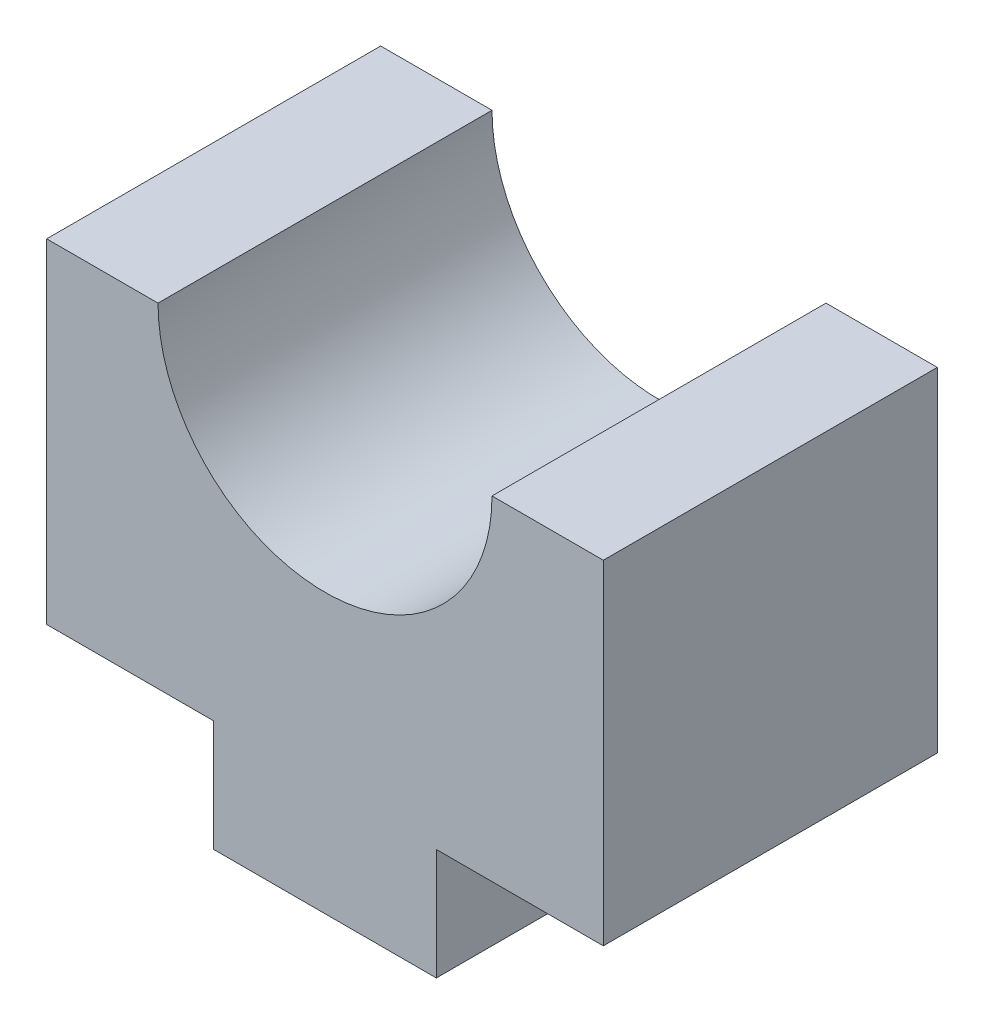
ISO-10303-21;
HEADER;
FILE_DESCRIPTION(('STEP AP214'),'2;1');
FILE_NAME('part.step','',(''),(''),'','','');
FILE_SCHEMA(('AUTOMOTIVE_DESIGN { 1 0 10303 214 1 1 1 1 }'));
ENDSEC;
DATA;
#1=APPLICATION_CONTEXT('core data for automotive mechanical design processes');
#2=APPLICATION_PROTOCOL_DEFINITION('international standard','automotive_design',2000,#1);
#3=PRODUCT_CONTEXT('',#1,'mechanical');
#4=PRODUCT('Part','Part','',(#3));
#5=PRODUCT_RELATED_PRODUCT_CATEGORY('part','',(#4));
#6=PRODUCT_DEFINITION_FORMATION('','',#4);
#7=PRODUCT_DEFINITION_CONTEXT('part definition',#1,'design');
#8=PRODUCT_DEFINITION('design','',#6,#7);
#9=PRODUCT_DEFINITION_SHAPE('','',#8);
#10=(LENGTH_UNIT() NAMED_UNIT(*) SI_UNIT(.MILLI.,.METRE.));
#11=(NAMED_UNIT(*) PLANE_ANGLE_UNIT() SI_UNIT($,.RADIAN.));
#12=(NAMED_UNIT(*) SI_UNIT($,.STERADIAN.) SOLID_ANGLE_UNIT());
#13=UNCERTAINTY_MEASURE_WITH_UNIT(LENGTH_MEASURE(1.E-05),#10,'distance_accuracy_value','');
#14=(GEOMETRIC_REPRESENTATION_CONTEXT(3) GLOBAL_UNCERTAINTY_ASSIGNED_CONTEXT((#13)) GLOBAL_UNIT_ASSIGNED_CONTEXT((#10,
#11,#12)) REPRESENTATION_CONTEXT('',''));
#15=CARTESIAN_POINT('',(0.,0.,0.));
#16=DIRECTION('',(0.,0.,1.));
#17=DIRECTION('',(1.,0.,0.));
#18=AXIS2_PLACEMENT_3D('',#15,#16,#17);
#19=CARTESIAN_POINT('',(0.,0.,-15.));
#20=DIRECTION('',(0.,0.,1.));
#21=DIRECTION('',(1.,0.,0.));
#22=AXIS2_PLACEMENT_3D('',#19,#20,#21);
#23=CYLINDRICAL_SURFACE('',#22,7.5);
#24=CARTESIAN_POINT('',(0.,0.,0.));
#25=DIRECTION('',(0.,0.,-1.));
#26=DIRECTION('',(1.,0.,0.));
#27=AXIS2_PLACEMENT_3D('',#24,#25,#26);
#28=CIRCLE('',#27,7.5);
#29=CARTESIAN_POINT('',(7.5,0.,0.));
#30=VERTEX_POINT('',#29);
#31=CARTESIAN_POINT('',(-7.5,0.,0.));
#32=VERTEX_POINT('',#31);
#33=EDGE_CURVE('E146',#30,#32,#28,.T.);
#34=ORIENTED_EDGE('',*,*,#33,.F.);
#35=DIRECTION('',(0.,0.,1.));
#36=VECTOR('',#35,1.);
#37=CARTESIAN_POINT('',(7.5,0.,-15.));
#38=LINE('',#37,#36);
#39=CARTESIAN_POINT('',(7.5,0.,-15.));
#40=VERTEX_POINT('',#39);
#41=EDGE_CURVE('E11',#40,#30,#38,.T.);
#42=ORIENTED_EDGE('',*,*,#41,.F.);
#43=CARTESIAN_POINT('',(0.,0.,-15.));
#44=DIRECTION('',(0.,0.,-1.));
#45=DIRECTION('',(1.,0.,0.));
#46=AXIS2_PLACEMENT_3D('',#43,#44,#45);
#47=CIRCLE('',#46,7.5);
#48=CARTESIAN_POINT('',(-7.5,0.,-15.));
#49=VERTEX_POINT('',#48);
#50=EDGE_CURVE('E172',#40,#49,#47,.T.);
#51=ORIENTED_EDGE('',*,*,#50,.T.);
#52=DIRECTION('',(0.,0.,1.));
#53=VECTOR('',#52,1.);
#54=CARTESIAN_POINT('',(-7.5,0.,-15.));
#55=LINE('',#54,#53);
#56=EDGE_CURVE('E40',#49,#32,#55,.T.);
#57=ORIENTED_EDGE('',*,*,#56,.T.);
#58=EDGE_LOOP('',(#34,#42,#51,#57));
#59=FACE_BOUND('',#58,.T.);
#60=ADVANCED_FACE('F37',(#59),#23,.F.);
#61=CARTESIAN_POINT('',(7.5,0.,-15.));
#62=DIRECTION('',(0.,1.,0.));
#63=DIRECTION('',(-1.,0.,0.));
#64=AXIS2_PLACEMENT_3D('',#61,#62,#63);
#65=PLANE('',#64);
#66=DIRECTION('',(-1.,0.,0.));
#67=VECTOR('',#66,1.);
#68=CARTESIAN_POINT('',(7.5,0.,0.));
#69=LINE('',#68,#67);
#70=CARTESIAN_POINT('',(12.5,0.,0.));
#71=VERTEX_POINT('',#70);
#72=EDGE_CURVE('E170',#71,#30,#69,.T.);
#73=ORIENTED_EDGE('',*,*,#72,.F.);
#74=DIRECTION('',(0.,0.,1.));
#75=VECTOR('',#74,1.);
#76=CARTESIAN_POINT('',(12.5,0.,-15.));
#77=LINE('',#76,#75);
#78=CARTESIAN_POINT('',(12.5,0.,-15.));
#79=VERTEX_POINT('',#78);
#80=EDGE_CURVE('E46',#79,#71,#77,.T.);
#81=ORIENTED_EDGE('',*,*,#80,.F.);
#82=DIRECTION('',(-1.,0.,0.));
#83=VECTOR('',#82,1.);
#84=CARTESIAN_POINT('',(7.5,0.,-15.));
#85=LINE('',#84,#83);
#86=EDGE_CURVE('E136',#79,#40,#85,.T.);
#87=ORIENTED_EDGE('',*,*,#86,.T.);
#88=ORIENTED_EDGE('',*,*,#41,.T.);
#89=EDGE_LOOP('',(#73,#81,#87,#88));
#90=FACE_BOUND('',#89,.T.);
#91=ADVANCED_FACE('F188',(#90),#65,.T.);
#92=CARTESIAN_POINT('',(12.5,0.,-15.));
#93=DIRECTION('',(1.,0.,0.));
#94=DIRECTION('',(0.,1.,0.));
#95=AXIS2_PLACEMENT_3D('',#92,#93,#94);
#96=PLANE('',#95);
#97=DIRECTION('',(0.,1.,0.));
#98=VECTOR('',#97,1.);
#99=CARTESIAN_POINT('',(12.5,0.,0.));
#100=LINE('',#99,#98);
#101=CARTESIAN_POINT('',(12.5,-15.,0.));
#102=VERTEX_POINT('',#101);
#103=EDGE_CURVE('E123',#102,#71,#100,.T.);
#104=ORIENTED_EDGE('',*,*,#103,.F.);
#105=DIRECTION('',(0.,0.,1.));
#106=VECTOR('',#105,1.);
#107=CARTESIAN_POINT('',(12.5,-15.,-15.));
#108=LINE('',#107,#106);
#109=CARTESIAN_POINT('',(12.5,-15.,-15.));
#110=VERTEX_POINT('',#109);
#111=EDGE_CURVE('E118',#110,#102,#108,.T.);
#112=ORIENTED_EDGE('',*,*,#111,.F.);
#113=DIRECTION('',(0.,1.,0.));
#114=VECTOR('',#113,1.);
#115=CARTESIAN_POINT('',(12.5,0.,-15.));
#116=LINE('',#115,#114);
#117=EDGE_CURVE('E121',#110,#79,#116,.T.);
#118=ORIENTED_EDGE('',*,*,#117,.T.);
#119=ORIENTED_EDGE('',*,*,#80,.T.);
#120=EDGE_LOOP('',(#104,#112,#118,#119));
#121=FACE_BOUND('',#120,.T.);
#122=ADVANCED_FACE('F120',(#121),#96,.T.);
#123=CARTESIAN_POINT('',(12.5,-15.,-15.));
#124=DIRECTION('',(0.,-1.,0.));
#125=DIRECTION('',(1.,0.,0.));
#126=AXIS2_PLACEMENT_3D('',#123,#124,#125);
#127=PLANE('',#126);
#128=DIRECTION('',(1.,0.,0.));
#129=VECTOR('',#128,1.);
#130=CARTESIAN_POINT('',(12.5,-15.,0.));
#131=LINE('',#130,#129);
#132=CARTESIAN_POINT('',(5.,-15.,0.));
#133=VERTEX_POINT('',#132);
#134=EDGE_CURVE('E167',#133,#102,#131,.T.);
#135=ORIENTED_EDGE('',*,*,#134,.F.);
#136=DIRECTION('',(0.,0.,1.));
#137=VECTOR('',#136,1.);
#138=CARTESIAN_POINT('',(5.,-15.,-15.));
#139=LINE('',#138,#137);
#140=CARTESIAN_POINT('',(5.,-15.,-15.));
#141=VERTEX_POINT('',#140);
#142=EDGE_CURVE('E128',#141,#133,#139,.T.);
#143=ORIENTED_EDGE('',*,*,#142,.F.);
#144=DIRECTION('',(1.,0.,0.));
#145=VECTOR('',#144,1.);
#146=CARTESIAN_POINT('',(12.5,-15.,-15.));
#147=LINE('',#146,#145);
#148=EDGE_CURVE('E134',#141,#110,#147,.T.);
#149=ORIENTED_EDGE('',*,*,#148,.T.);
#150=ORIENTED_EDGE('',*,*,#111,.T.);
#151=EDGE_LOOP('',(#135,#143,#149,#150));
#152=FACE_BOUND('',#151,.T.);
#153=ADVANCED_FACE('F138',(#152),#127,.T.);
#154=CARTESIAN_POINT('',(5.,-15.,-15.));
#155=DIRECTION('',(1.,0.,0.));
#156=DIRECTION('',(0.,0.,-1.));
#157=AXIS2_PLACEMENT_3D('',#154,#155,#156);
#158=PLANE('',#157);
#159=DIRECTION('',(0.,1.,0.));
#160=VECTOR('',#159,1.);
#161=CARTESIAN_POINT('',(5.,-15.,0.));
#162=LINE('',#161,#160);
#163=CARTESIAN_POINT('',(5.,-20.,0.));
#164=VERTEX_POINT('',#163);
#165=EDGE_CURVE('E164',#164,#133,#162,.T.);
#166=ORIENTED_EDGE('',*,*,#165,.F.);
#167=DIRECTION('',(0.,0.,1.));
#168=VECTOR('',#167,1.);
#169=CARTESIAN_POINT('',(5.,-20.,-15.));
#170=LINE('',#169,#168);
#171=CARTESIAN_POINT('',(5.,-20.,-15.));
#172=VERTEX_POINT('',#171);
#173=EDGE_CURVE('E176',#172,#164,#170,.T.);
#174=ORIENTED_EDGE('',*,*,#173,.F.);
#175=DIRECTION('',(0.,1.,0.));
#176=VECTOR('',#175,1.);
#177=CARTESIAN_POINT('',(5.,-15.,-15.));
#178=LINE('',#177,#176);
#179=EDGE_CURVE('E139',#172,#141,#178,.T.);
#180=ORIENTED_EDGE('',*,*,#179,.T.);
#181=ORIENTED_EDGE('',*,*,#142,.T.);
#182=EDGE_LOOP('',(#166,#174,#180,#181));
#183=FACE_BOUND('',#182,.T.);
#184=ADVANCED_FACE('F201',(#183),#158,.T.);
#185=CARTESIAN_POINT('',(5.,-20.,-15.));
#186=DIRECTION('',(0.,-1.,0.));
#187=DIRECTION('',(0.,0.,-1.));
#188=AXIS2_PLACEMENT_3D('',#185,#186,#187);
#189=PLANE('',#188);
#190=DIRECTION('',(1.,0.,0.));
#191=VECTOR('',#190,1.);
#192=CARTESIAN_POINT('',(5.,-20.,0.));
#193=LINE('',#192,#191);
#194=CARTESIAN_POINT('',(-5.,-20.,0.));
#195=VERTEX_POINT('',#194);
#196=EDGE_CURVE('E161',#195,#164,#193,.T.);
#197=ORIENTED_EDGE('',*,*,#196,.F.);
#198=DIRECTION('',(0.,0.,1.));
#199=VECTOR('',#198,1.);
#200=CARTESIAN_POINT('',(-5.,-20.,-15.));
#201=LINE('',#200,#199);
#202=CARTESIAN_POINT('',(-5.,-20.,-15.));
#203=VERTEX_POINT('',#202);
#204=EDGE_CURVE('E178',#203,#195,#201,.T.);
#205=ORIENTED_EDGE('',*,*,#204,.F.);
#206=DIRECTION('',(1.,0.,0.));
#207=VECTOR('',#206,1.);
#208=CARTESIAN_POINT('',(5.,-20.,-15.));
#209=LINE('',#208,#207);
#210=EDGE_CURVE('E141',#203,#172,#209,.T.);
#211=ORIENTED_EDGE('',*,*,#210,.T.);
#212=ORIENTED_EDGE('',*,*,#173,.T.);
#213=EDGE_LOOP('',(#197,#205,#211,#212));
#214=FACE_BOUND('',#213,.T.);
#215=ADVANCED_FACE('F204',(#214),#189,.T.);
#216=CARTESIAN_POINT('',(-5.,-20.,-15.));
#217=DIRECTION('',(-1.,0.,0.));
#218=DIRECTION('',(0.,0.,1.));
#219=AXIS2_PLACEMENT_3D('',#216,#217,#218);
#220=PLANE('',#219);
#221=DIRECTION('',(0.,-1.,0.));
#222=VECTOR('',#221,1.);
#223=CARTESIAN_POINT('',(-5.,-20.,0.));
#224=LINE('',#223,#222);
#225=CARTESIAN_POINT('',(-5.,-15.,0.));
#226=VERTEX_POINT('',#225);
#227=EDGE_CURVE('E158',#226,#195,#224,.T.);
#228=ORIENTED_EDGE('',*,*,#227,.F.);
#229=DIRECTION('',(0.,0.,1.));
#230=VECTOR('',#229,1.);
#231=CARTESIAN_POINT('',(-5.,-15.,-15.));
#232=LINE('',#231,#230);
#233=CARTESIAN_POINT('',(-5.,-15.,-15.));
#234=VERTEX_POINT('',#233);
#235=EDGE_CURVE('E180',#234,#226,#232,.T.);
#236=ORIENTED_EDGE('',*,*,#235,.F.);
#237=DIRECTION('',(0.,-1.,0.));
#238=VECTOR('',#237,1.);
#239=CARTESIAN_POINT('',(-5.,-20.,-15.));
#240=LINE('',#239,#238);
#241=EDGE_CURVE('E303',#234,#203,#240,.T.);
#242=ORIENTED_EDGE('',*,*,#241,.T.);
#243=ORIENTED_EDGE('',*,*,#204,.T.);
#244=EDGE_LOOP('',(#228,#236,#242,#243));
#245=FACE_BOUND('',#244,.T.);
#246=ADVANCED_FACE('F208',(#245),#220,.T.);
#247=CARTESIAN_POINT('',(-5.,-15.,-15.));
#248=DIRECTION('',(0.,-1.,0.));
#249=DIRECTION('',(0.,0.,-1.));
#250=AXIS2_PLACEMENT_3D('',#247,#248,#249);
#251=PLANE('',#250);
#252=DIRECTION('',(1.,0.,0.));
#253=VECTOR('',#252,1.);
#254=CARTESIAN_POINT('',(-5.,-15.,0.));
#255=LINE('',#254,#253);
#256=CARTESIAN_POINT('',(-12.5,-15.,0.));
#257=VERTEX_POINT('',#256);
#258=EDGE_CURVE('E155',#257,#226,#255,.T.);
#259=ORIENTED_EDGE('',*,*,#258,.F.);
#260=DIRECTION('',(0.,0.,1.));
#261=VECTOR('',#260,1.);
#262=CARTESIAN_POINT('',(-12.5,-15.,-15.));
#263=LINE('',#262,#261);
#264=CARTESIAN_POINT('',(-12.5,-15.,-15.));
#265=VERTEX_POINT('',#264);
#266=EDGE_CURVE('E182',#265,#257,#263,.T.);
#267=ORIENTED_EDGE('',*,*,#266,.F.);
#268=DIRECTION('',(1.,0.,0.));
#269=VECTOR('',#268,1.);
#270=CARTESIAN_POINT('',(-5.,-15.,-15.));
#271=LINE('',#270,#269);
#272=EDGE_CURVE('E299',#265,#234,#271,.T.);
#273=ORIENTED_EDGE('',*,*,#272,.T.);
#274=ORIENTED_EDGE('',*,*,#235,.T.);
#275=EDGE_LOOP('',(#259,#267,#273,#274));
#276=FACE_BOUND('',#275,.T.);
#277=ADVANCED_FACE('F212',(#276),#251,.T.);
#278=CARTESIAN_POINT('',(-12.5,-15.,-15.));
#279=DIRECTION('',(-1.,0.,0.));
#280=DIRECTION('',(0.,0.,1.));
#281=AXIS2_PLACEMENT_3D('',#278,#279,#280);
#282=PLANE('',#281);
#283=DIRECTION('',(0.,-1.,0.));
#284=VECTOR('',#283,1.);
#285=CARTESIAN_POINT('',(-12.5,-15.,0.));
#286=LINE('',#285,#284);
#287=CARTESIAN_POINT('',(-12.5,0.,0.));
#288=VERTEX_POINT('',#287);
#289=EDGE_CURVE('E152',#288,#257,#286,.T.);
#290=ORIENTED_EDGE('',*,*,#289,.F.);
#291=DIRECTION('',(0.,0.,1.));
#292=VECTOR('',#291,1.);
#293=CARTESIAN_POINT('',(-12.5,0.,-15.));
#294=LINE('',#293,#292);
#295=CARTESIAN_POINT('',(-12.5,0.,-15.));
#296=VERTEX_POINT('',#295);
#297=EDGE_CURVE('E183',#296,#288,#294,.T.);
#298=ORIENTED_EDGE('',*,*,#297,.F.);
#299=DIRECTION('',(0.,-1.,0.));
#300=VECTOR('',#299,1.);
#301=CARTESIAN_POINT('',(-12.5,-15.,-15.));
#302=LINE('',#301,#300);
#303=EDGE_CURVE('E310',#296,#265,#302,.T.);
#304=ORIENTED_EDGE('',*,*,#303,.T.);
#305=ORIENTED_EDGE('',*,*,#266,.T.);
#306=EDGE_LOOP('',(#290,#298,#304,#305));
#307=FACE_BOUND('',#306,.T.);
#308=ADVANCED_FACE('F216',(#307),#282,.T.);
#309=CARTESIAN_POINT('',(-12.5,0.,-15.));
#310=DIRECTION('',(0.,1.,0.));
#311=DIRECTION('',(0.,0.,1.));
#312=AXIS2_PLACEMENT_3D('',#309,#310,#311);
#313=PLANE('',#312);
#314=DIRECTION('',(-1.,0.,0.));
#315=VECTOR('',#314,1.);
#316=CARTESIAN_POINT('',(-12.5,0.,0.));
#317=LINE('',#316,#315);
#318=EDGE_CURVE('E149',#32,#288,#317,.T.);
#319=ORIENTED_EDGE('',*,*,#318,.F.);
#320=ORIENTED_EDGE('',*,*,#56,.F.);
#321=DIRECTION('',(-1.,0.,0.));
#322=VECTOR('',#321,1.);
#323=CARTESIAN_POINT('',(-12.5,0.,-15.));
#324=LINE('',#323,#322);
#325=EDGE_CURVE('E312',#49,#296,#324,.T.);
#326=ORIENTED_EDGE('',*,*,#325,.T.);
#327=ORIENTED_EDGE('',*,*,#297,.T.);
#328=EDGE_LOOP('',(#319,#320,#326,#327));
#329=FACE_BOUND('',#328,.T.);
#330=ADVANCED_FACE('F185',(#329),#313,.T.);
#331=CARTESIAN_POINT('',(0.,0.,-15.));
#332=DIRECTION('',(0.,0.,1.));
#333=DIRECTION('',(1.,0.,0.));
#334=AXIS2_PLACEMENT_3D('',#331,#332,#333);
#335=PLANE('',#334);
#336=ORIENTED_EDGE('',*,*,#50,.F.);
#337=ORIENTED_EDGE('',*,*,#86,.F.);
#338=ORIENTED_EDGE('',*,*,#117,.F.);
#339=ORIENTED_EDGE('',*,*,#148,.F.);
#340=ORIENTED_EDGE('',*,*,#179,.F.);
#341=ORIENTED_EDGE('',*,*,#210,.F.);
#342=ORIENTED_EDGE('',*,*,#241,.F.);
#343=ORIENTED_EDGE('',*,*,#272,.F.);
#344=ORIENTED_EDGE('',*,*,#303,.F.);
#345=ORIENTED_EDGE('',*,*,#325,.F.);
#346=EDGE_LOOP('',(#336,#337,#338,#339,#340,#341,#342,#343,#344,#345));
#347=FACE_BOUND('',#346,.T.);
#348=ADVANCED_FACE('F132',(#347),#335,.F.);
#349=CARTESIAN_POINT('',(0.,0.,0.));
#350=DIRECTION('',(0.,0.,1.));
#351=DIRECTION('',(1.,0.,0.));
#352=AXIS2_PLACEMENT_3D('',#349,#350,#351);
#353=PLANE('',#352);
#354=ORIENTED_EDGE('',*,*,#33,.T.);
#355=ORIENTED_EDGE('',*,*,#318,.T.);
#356=ORIENTED_EDGE('',*,*,#289,.T.);
#357=ORIENTED_EDGE('',*,*,#258,.T.);
#358=ORIENTED_EDGE('',*,*,#227,.T.);
#359=ORIENTED_EDGE('',*,*,#196,.T.);
#360=ORIENTED_EDGE('',*,*,#165,.T.);
#361=ORIENTED_EDGE('',*,*,#134,.T.);
#362=ORIENTED_EDGE('',*,*,#103,.T.);
#363=ORIENTED_EDGE('',*,*,#72,.T.);
#364=EDGE_LOOP('',(#354,#355,#356,#357,#358,#359,#360,#361,#362,#363));
#365=FACE_BOUND('',#364,.T.);
#366=ADVANCED_FACE('F187',(#365),#353,.T.);
#367=CLOSED_SHELL('',(#60,#91,#122,#153,#184,#215,#246,#277,#308,#330,#348,#366));
#368=MANIFOLD_SOLID_BREP('B2',#367);
#369=ADVANCED_BREP_SHAPE_REPRESENTATION('',(#18,#368),#14);
#370=SHAPE_DEFINITION_REPRESENTATION(#9,#369);
ENDSEC;
END-ISO-10303-21;
